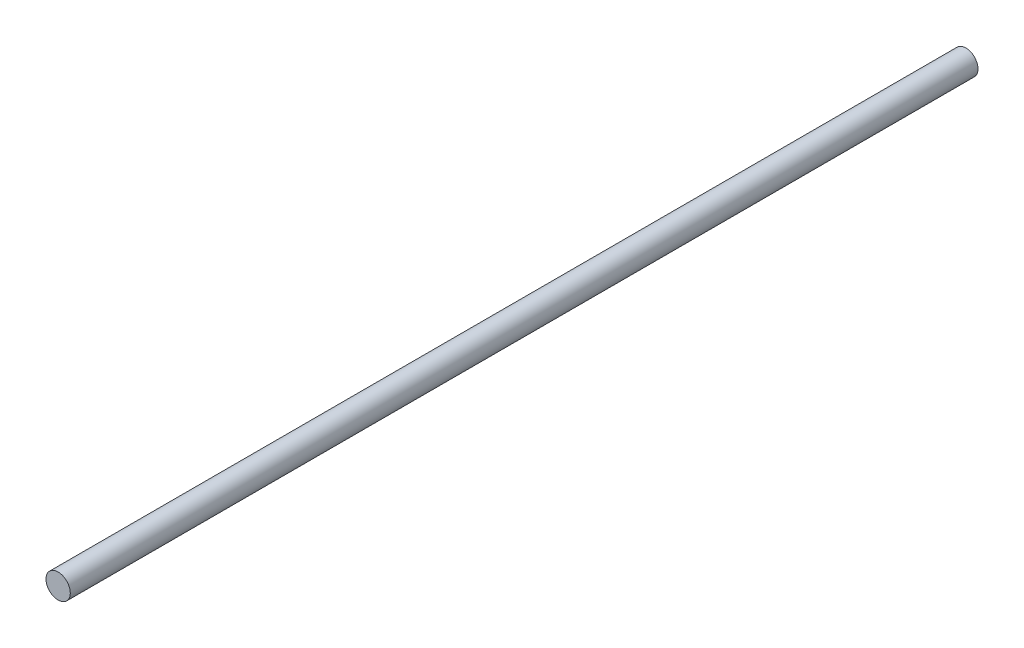
ISO-10303-21;
HEADER;
FILE_DESCRIPTION(('STEP AP214'),'2;1');
FILE_NAME('part.step','',(''),(''),'','','');
FILE_SCHEMA(('AUTOMOTIVE_DESIGN { 1 0 10303 214 1 1 1 1 }'));
ENDSEC;
DATA;
#1=APPLICATION_CONTEXT('core data for automotive mechanical design processes');
#2=APPLICATION_PROTOCOL_DEFINITION('international standard','automotive_design',2000,#1);
#3=PRODUCT_CONTEXT('',#1,'mechanical');
#4=PRODUCT('Part','Part','',(#3));
#5=PRODUCT_RELATED_PRODUCT_CATEGORY('part','',(#4));
#6=PRODUCT_DEFINITION_FORMATION('','',#4);
#7=PRODUCT_DEFINITION_CONTEXT('part definition',#1,'design');
#8=PRODUCT_DEFINITION('design','',#6,#7);
#9=PRODUCT_DEFINITION_SHAPE('','',#8);
#10=(LENGTH_UNIT() NAMED_UNIT(*) SI_UNIT(.MILLI.,.METRE.));
#11=(NAMED_UNIT(*) PLANE_ANGLE_UNIT() SI_UNIT($,.RADIAN.));
#12=(NAMED_UNIT(*) SI_UNIT($,.STERADIAN.) SOLID_ANGLE_UNIT());
#13=UNCERTAINTY_MEASURE_WITH_UNIT(LENGTH_MEASURE(1.E-05),#10,'distance_accuracy_value','');
#14=(GEOMETRIC_REPRESENTATION_CONTEXT(3) GLOBAL_UNCERTAINTY_ASSIGNED_CONTEXT((#13)) GLOBAL_UNIT_ASSIGNED_CONTEXT((#10,
#11,#12)) REPRESENTATION_CONTEXT('',''));
#15=CARTESIAN_POINT('',(0.,0.,0.));
#16=DIRECTION('',(0.,0.,1.));
#17=DIRECTION('',(1.,0.,0.));
#18=AXIS2_PLACEMENT_3D('',#15,#16,#17);
#19=CARTESIAN_POINT('',(0.,0.,373.35));
#20=DIRECTION('',(0.,0.,-1.));
#21=DIRECTION('',(-1.,0.,0.));
#22=AXIS2_PLACEMENT_3D('',#19,#20,#21);
#23=CYLINDRICAL_SURFACE('',#22,5.);
#24=CARTESIAN_POINT('',(0.,0.,373.35));
#25=DIRECTION('',(0.,0.,1.));
#26=DIRECTION('',(1.,0.,0.));
#27=AXIS2_PLACEMENT_3D('',#24,#25,#26);
#28=CIRCLE('',#27,5.);
#29=CARTESIAN_POINT('',(5.,0.,373.35));
#30=VERTEX_POINT('',#29);
#31=EDGE_CURVE('E10',#30,#30,#28,.T.);
#32=ORIENTED_EDGE('',*,*,#31,.F.);
#33=EDGE_LOOP('',(#32));
#34=FACE_BOUND('',#33,.T.);
#35=CARTESIAN_POINT('',(0.,0.,0.));
#36=DIRECTION('',(0.,0.,1.));
#37=DIRECTION('',(1.,0.,0.));
#38=AXIS2_PLACEMENT_3D('',#35,#36,#37);
#39=CIRCLE('',#38,5.);
#40=CARTESIAN_POINT('',(5.,0.,0.));
#41=VERTEX_POINT('',#40);
#42=EDGE_CURVE('E38',#41,#41,#39,.T.);
#43=ORIENTED_EDGE('',*,*,#42,.T.);
#44=EDGE_LOOP('',(#43));
#45=FACE_BOUND('',#44,.T.);
#46=ADVANCED_FACE('F35',(#34,#45),#23,.T.);
#47=CARTESIAN_POINT('',(0.,0.,373.35));
#48=DIRECTION('',(0.,0.,1.));
#49=DIRECTION('',(1.,0.,0.));
#50=AXIS2_PLACEMENT_3D('',#47,#48,#49);
#51=PLANE('',#50);
#52=ORIENTED_EDGE('',*,*,#31,.T.);
#53=EDGE_LOOP('',(#52));
#54=FACE_BOUND('',#53,.T.);
#55=ADVANCED_FACE('F52',(#54),#51,.T.);
#56=CARTESIAN_POINT('',(0.,0.,0.));
#57=DIRECTION('',(0.,0.,1.));
#58=DIRECTION('',(1.,0.,0.));
#59=AXIS2_PLACEMENT_3D('',#56,#57,#58);
#60=PLANE('',#59);
#61=ORIENTED_EDGE('',*,*,#42,.F.);
#62=EDGE_LOOP('',(#61));
#63=FACE_BOUND('',#62,.T.);
#64=ADVANCED_FACE('F50',(#63),#60,.F.);
#65=CLOSED_SHELL('',(#46,#55,#64));
#66=MANIFOLD_SOLID_BREP('B2',#65);
#67=ADVANCED_BREP_SHAPE_REPRESENTATION('',(#18,#66),#14);
#68=SHAPE_DEFINITION_REPRESENTATION(#9,#67);
ENDSEC;
END-ISO-10303-21;
